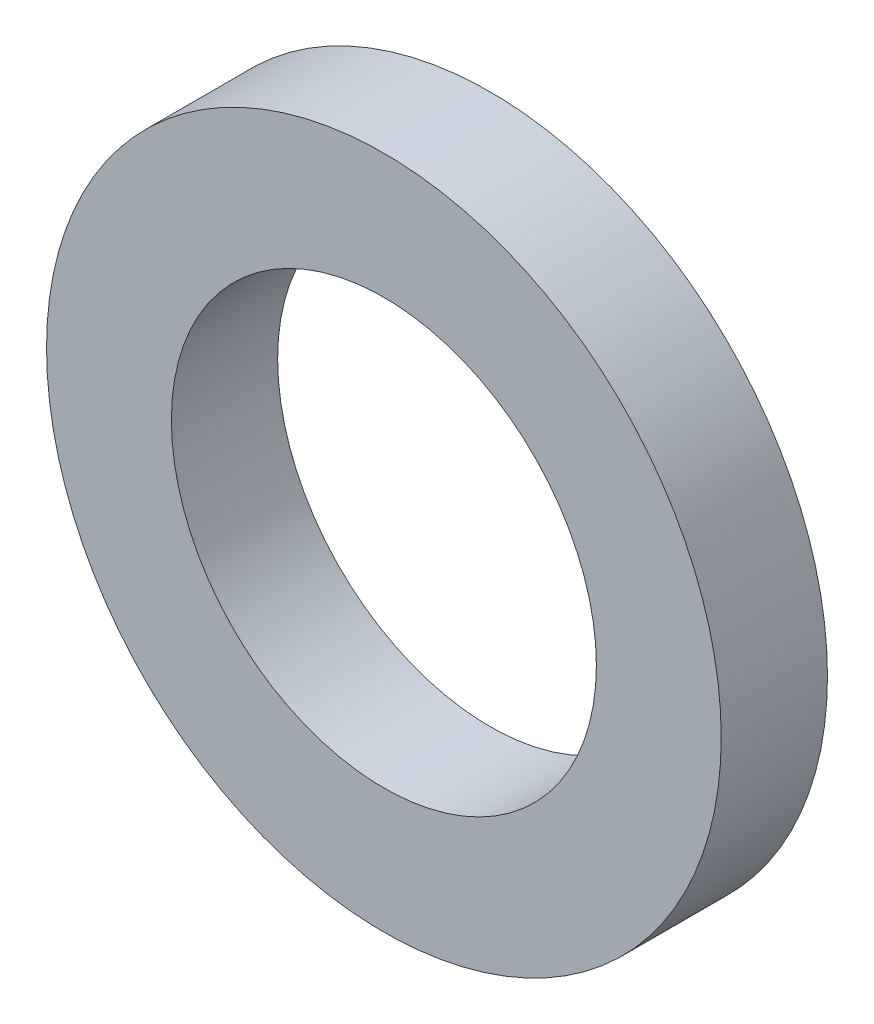
ISO-10303-21;
HEADER;
FILE_DESCRIPTION(('STEP AP214'),'2;1');
FILE_NAME('part.step','',(''),(''),'','','');
FILE_SCHEMA(('AUTOMOTIVE_DESIGN { 1 0 10303 214 1 1 1 1 }'));
ENDSEC;
DATA;
#1=APPLICATION_CONTEXT('core data for automotive mechanical design processes');
#2=APPLICATION_PROTOCOL_DEFINITION('international standard','automotive_design',2000,#1);
#3=PRODUCT_CONTEXT('',#1,'mechanical');
#4=PRODUCT('Part','Part','',(#3));
#5=PRODUCT_RELATED_PRODUCT_CATEGORY('part','',(#4));
#6=PRODUCT_DEFINITION_FORMATION('','',#4);
#7=PRODUCT_DEFINITION_CONTEXT('part definition',#1,'design');
#8=PRODUCT_DEFINITION('design','',#6,#7);
#9=PRODUCT_DEFINITION_SHAPE('','',#8);
#10=(LENGTH_UNIT() NAMED_UNIT(*) SI_UNIT(.MILLI.,.METRE.));
#11=(NAMED_UNIT(*) PLANE_ANGLE_UNIT() SI_UNIT($,.RADIAN.));
#12=(NAMED_UNIT(*) SI_UNIT($,.STERADIAN.) SOLID_ANGLE_UNIT());
#13=UNCERTAINTY_MEASURE_WITH_UNIT(LENGTH_MEASURE(1.E-05),#10,'distance_accuracy_value','');
#14=(GEOMETRIC_REPRESENTATION_CONTEXT(3) GLOBAL_UNCERTAINTY_ASSIGNED_CONTEXT((#13)) GLOBAL_UNIT_ASSIGNED_CONTEXT((#10,
#11,#12)) REPRESENTATION_CONTEXT('',''));
#15=CARTESIAN_POINT('',(0.,0.,0.));
#16=DIRECTION('',(0.,0.,1.));
#17=DIRECTION('',(1.,0.,0.));
#18=AXIS2_PLACEMENT_3D('',#15,#16,#17);
#19=CARTESIAN_POINT('',(0.,0.,2.));
#20=DIRECTION('',(0.,0.,1.));
#21=DIRECTION('',(1.,0.,0.));
#22=AXIS2_PLACEMENT_3D('',#19,#20,#21);
#23=PLANE('',#22);
#24=CARTESIAN_POINT('',(0.,0.,2.));
#25=DIRECTION('',(0.,0.,1.));
#26=DIRECTION('',(1.,0.,0.));
#27=AXIS2_PLACEMENT_3D('',#24,#25,#26);
#28=CIRCLE('',#27,6.35);
#29=CARTESIAN_POINT('',(6.35,0.,2.));
#30=VERTEX_POINT('',#29);
#31=EDGE_CURVE('E10',#30,#30,#28,.T.);
#32=ORIENTED_EDGE('',*,*,#31,.T.);
#33=EDGE_LOOP('',(#32));
#34=FACE_BOUND('',#33,.T.);
#35=CARTESIAN_POINT('',(0.,0.,2.));
#36=DIRECTION('',(0.,0.,1.));
#37=DIRECTION('',(1.,0.,0.));
#38=AXIS2_PLACEMENT_3D('',#35,#36,#37);
#39=CIRCLE('',#38,4.);
#40=CARTESIAN_POINT('',(4.,0.,2.));
#41=VERTEX_POINT('',#40);
#42=EDGE_CURVE('E48',#41,#41,#39,.T.);
#43=ORIENTED_EDGE('',*,*,#42,.F.);
#44=EDGE_LOOP('',(#43));
#45=FACE_BOUND('',#44,.T.);
#46=ADVANCED_FACE('F37',(#34,#45),#23,.T.);
#47=CARTESIAN_POINT('',(0.,0.,0.));
#48=DIRECTION('',(0.,0.,1.));
#49=DIRECTION('',(1.,0.,0.));
#50=AXIS2_PLACEMENT_3D('',#47,#48,#49);
#51=PLANE('',#50);
#52=CARTESIAN_POINT('',(0.,0.,0.));
#53=DIRECTION('',(0.,0.,1.));
#54=DIRECTION('',(1.,0.,0.));
#55=AXIS2_PLACEMENT_3D('',#52,#53,#54);
#56=CIRCLE('',#55,6.35);
#57=CARTESIAN_POINT('',(6.35,0.,0.));
#58=VERTEX_POINT('',#57);
#59=EDGE_CURVE('E41',#58,#58,#56,.T.);
#60=ORIENTED_EDGE('',*,*,#59,.F.);
#61=EDGE_LOOP('',(#60));
#62=FACE_BOUND('',#61,.T.);
#63=CARTESIAN_POINT('',(0.,0.,0.));
#64=DIRECTION('',(0.,0.,1.));
#65=DIRECTION('',(1.,0.,0.));
#66=AXIS2_PLACEMENT_3D('',#63,#64,#65);
#67=CIRCLE('',#66,4.);
#68=CARTESIAN_POINT('',(4.,0.,0.));
#69=VERTEX_POINT('',#68);
#70=EDGE_CURVE('E50',#69,#69,#67,.T.);
#71=ORIENTED_EDGE('',*,*,#70,.T.);
#72=EDGE_LOOP('',(#71));
#73=FACE_BOUND('',#72,.T.);
#74=ADVANCED_FACE('F60',(#62,#73),#51,.F.);
#75=CARTESIAN_POINT('',(0.,0.,2.));
#76=DIRECTION('',(0.,0.,-1.));
#77=DIRECTION('',(-1.,0.,0.));
#78=AXIS2_PLACEMENT_3D('',#75,#76,#77);
#79=CYLINDRICAL_SURFACE('',#78,6.35);
#80=ORIENTED_EDGE('',*,*,#31,.F.);
#81=EDGE_LOOP('',(#80));
#82=FACE_BOUND('',#81,.T.);
#83=ORIENTED_EDGE('',*,*,#59,.T.);
#84=EDGE_LOOP('',(#83));
#85=FACE_BOUND('',#84,.T.);
#86=ADVANCED_FACE('F39',(#82,#85),#79,.T.);
#87=CARTESIAN_POINT('',(0.,0.,2.));
#88=DIRECTION('',(0.,0.,-1.));
#89=DIRECTION('',(-1.,0.,0.));
#90=AXIS2_PLACEMENT_3D('',#87,#88,#89);
#91=CYLINDRICAL_SURFACE('',#90,4.);
#92=ORIENTED_EDGE('',*,*,#42,.T.);
#93=EDGE_LOOP('',(#92));
#94=FACE_BOUND('',#93,.T.);
#95=ORIENTED_EDGE('',*,*,#70,.F.);
#96=EDGE_LOOP('',(#95));
#97=FACE_BOUND('',#96,.T.);
#98=ADVANCED_FACE('F56',(#94,#97),#91,.F.);
#99=CLOSED_SHELL('',(#46,#74,#86,#98));
#100=MANIFOLD_SOLID_BREP('B2',#99);
#101=ADVANCED_BREP_SHAPE_REPRESENTATION('',(#18,#100),#14);
#102=SHAPE_DEFINITION_REPRESENTATION(#9,#101);
ENDSEC;
END-ISO-10303-21;
